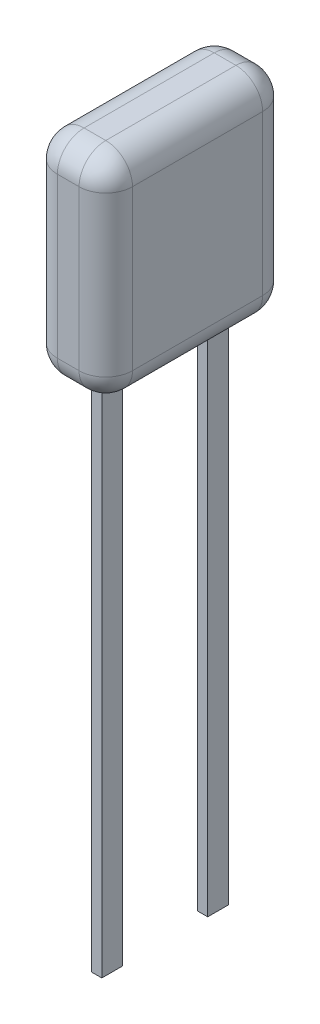
ISO-10303-21;
HEADER;
FILE_DESCRIPTION(('STEP AP214'),'2;1');
FILE_NAME('part.step','',(''),(''),'','','');
FILE_SCHEMA(('AUTOMOTIVE_DESIGN { 1 0 10303 214 1 1 1 1 }'));
ENDSEC;
DATA;
#1=APPLICATION_CONTEXT('core data for automotive mechanical design processes');
#2=APPLICATION_PROTOCOL_DEFINITION('international standard','automotive_design',2000,#1);
#3=PRODUCT_CONTEXT('',#1,'mechanical');
#4=PRODUCT('Part','Part','',(#3));
#5=PRODUCT_RELATED_PRODUCT_CATEGORY('part','',(#4));
#6=PRODUCT_DEFINITION_FORMATION('','',#4);
#7=PRODUCT_DEFINITION_CONTEXT('part definition',#1,'design');
#8=PRODUCT_DEFINITION('design','',#6,#7);
#9=PRODUCT_DEFINITION_SHAPE('','',#8);
#10=(LENGTH_UNIT() NAMED_UNIT(*) SI_UNIT(.MILLI.,.METRE.));
#11=(NAMED_UNIT(*) PLANE_ANGLE_UNIT() SI_UNIT($,.RADIAN.));
#12=(NAMED_UNIT(*) SI_UNIT($,.STERADIAN.) SOLID_ANGLE_UNIT());
#13=UNCERTAINTY_MEASURE_WITH_UNIT(LENGTH_MEASURE(1.E-05),#10,'distance_accuracy_value','');
#14=(GEOMETRIC_REPRESENTATION_CONTEXT(3) GLOBAL_UNCERTAINTY_ASSIGNED_CONTEXT((#13)) GLOBAL_UNIT_ASSIGNED_CONTEXT((#10,
#11,#12)) REPRESENTATION_CONTEXT('',''));
#15=CARTESIAN_POINT('',(0.,0.,0.));
#16=DIRECTION('',(0.,0.,1.));
#17=DIRECTION('',(1.,0.,0.));
#18=AXIS2_PLACEMENT_3D('',#15,#16,#17);
#19=CARTESIAN_POINT('',(0.775,-2.26338146433723,-1.019106057086));
#20=DIRECTION('',(0.,0.,1.));
#21=DIRECTION('',(1.,0.,0.));
#22=AXIS2_PLACEMENT_3D('',#19,#20,#21);
#23=PLANE('',#22);
#24=DIRECTION('',(1.,0.,0.));
#25=VECTOR('',#24,1.);
#26=CARTESIAN_POINT('',(0.775,-14.9260033618663,-1.019106057086));
#27=LINE('',#26,#25);
#28=CARTESIAN_POINT('',(0.775,-14.9260033618663,-1.019106057086));
#29=VERTEX_POINT('',#28);
#30=CARTESIAN_POINT('',(1.025,-14.9260033618663,-1.019106057086));
#31=VERTEX_POINT('',#30);
#32=EDGE_CURVE('E50',#29,#31,#27,.T.);
#33=ORIENTED_EDGE('',*,*,#32,.T.);
#34=DIRECTION('',(0.,-1.,0.));
#35=VECTOR('',#34,1.);
#36=CARTESIAN_POINT('',(1.025,-2.26338146433723,-1.019106057086));
#37=LINE('',#36,#35);
#38=CARTESIAN_POINT('',(1.025,-2.26338146433723,-1.019106057086));
#39=VERTEX_POINT('',#38);
#40=EDGE_CURVE('E105',#39,#31,#37,.T.);
#41=ORIENTED_EDGE('',*,*,#40,.F.);
#42=DIRECTION('',(1.,0.,0.));
#43=VECTOR('',#42,1.);
#44=CARTESIAN_POINT('',(0.775,-2.26338146433723,-1.019106057086));
#45=LINE('',#44,#43);
#46=CARTESIAN_POINT('',(0.775,-2.26338146433723,-1.019106057086));
#47=VERTEX_POINT('',#46);
#48=EDGE_CURVE('E12',#47,#39,#45,.T.);
#49=ORIENTED_EDGE('',*,*,#48,.F.);
#50=DIRECTION('',(0.,-1.,0.));
#51=VECTOR('',#50,1.);
#52=CARTESIAN_POINT('',(0.775,-2.26338146433723,-1.019106057086));
#53=LINE('',#52,#51);
#54=EDGE_CURVE('E106',#47,#29,#53,.T.);
#55=ORIENTED_EDGE('',*,*,#54,.T.);
#56=EDGE_LOOP('',(#33,#41,#49,#55));
#57=FACE_BOUND('',#56,.T.);
#58=ADVANCED_FACE('F47',(#57),#23,.T.);
#59=CARTESIAN_POINT('',(0.775,-1.34137705703162,-0.438562536616451));
#60=DIRECTION('',(0.,-0.532827878334062,0.846223641876083));
#61=DIRECTION('',(0.,-0.846223641876083,-0.532827878334062));
#62=AXIS2_PLACEMENT_3D('',#59,#60,#61);
#63=PLANE('',#62);
#64=ORIENTED_EDGE('',*,*,#48,.T.);
#65=DIRECTION('',(0.,-0.846223641876083,-0.532827878334062));
#66=VECTOR('',#65,1.);
#67=CARTESIAN_POINT('',(1.025,-1.34137705703162,-0.438562536616451));
#68=LINE('',#67,#66);
#69=CARTESIAN_POINT('',(1.025,-1.34137705703162,-0.438562536616451));
#70=VERTEX_POINT('',#69);
#71=EDGE_CURVE('E124',#70,#39,#68,.T.);
#72=ORIENTED_EDGE('',*,*,#71,.F.);
#73=DIRECTION('',(1.,0.,0.));
#74=VECTOR('',#73,1.);
#75=CARTESIAN_POINT('',(0.775,-1.34137705703162,-0.438562536616451));
#76=LINE('',#75,#74);
#77=CARTESIAN_POINT('',(0.775,-1.34137705703162,-0.438562536616451));
#78=VERTEX_POINT('',#77);
#79=EDGE_CURVE('E55',#78,#70,#76,.T.);
#80=ORIENTED_EDGE('',*,*,#79,.F.);
#81=DIRECTION('',(0.,-0.846223641876083,-0.532827878334062));
#82=VECTOR('',#81,1.);
#83=CARTESIAN_POINT('',(0.775,-1.34137705703162,-0.438562536616451));
#84=LINE('',#83,#82);
#85=EDGE_CURVE('E111',#78,#47,#84,.T.);
#86=ORIENTED_EDGE('',*,*,#85,.T.);
#87=EDGE_LOOP('',(#64,#72,#80,#86));
#88=FACE_BOUND('',#87,.T.);
#89=ADVANCED_FACE('F182',(#88),#63,.T.);
#90=CARTESIAN_POINT('',(0.775,-1.34137705703162,1.56));
#91=DIRECTION('',(0.,-1.,0.));
#92=DIRECTION('',(0.,0.,-1.));
#93=AXIS2_PLACEMENT_3D('',#90,#91,#92);
#94=PLANE('',#93);
#95=ORIENTED_EDGE('',*,*,#79,.T.);
#96=DIRECTION('',(0.,0.,-1.));
#97=VECTOR('',#96,1.);
#98=CARTESIAN_POINT('',(1.025,-1.34137705703162,1.56));
#99=LINE('',#98,#97);
#100=CARTESIAN_POINT('',(1.025,-1.34137705703162,1.56));
#101=VERTEX_POINT('',#100);
#102=EDGE_CURVE('E137',#101,#70,#99,.T.);
#103=ORIENTED_EDGE('',*,*,#102,.F.);
#104=DIRECTION('',(1.,0.,0.));
#105=VECTOR('',#104,1.);
#106=CARTESIAN_POINT('',(0.775,-1.34137705703162,1.56));
#107=LINE('',#106,#105);
#108=CARTESIAN_POINT('',(0.775,-1.34137705703162,1.56));
#109=VERTEX_POINT('',#108);
#110=EDGE_CURVE('E158',#109,#101,#107,.T.);
#111=ORIENTED_EDGE('',*,*,#110,.F.);
#112=DIRECTION('',(0.,0.,-1.));
#113=VECTOR('',#112,1.);
#114=CARTESIAN_POINT('',(0.775,-1.34137705703162,1.56));
#115=LINE('',#114,#113);
#116=EDGE_CURVE('E154',#109,#78,#115,.T.);
#117=ORIENTED_EDGE('',*,*,#116,.T.);
#118=EDGE_LOOP('',(#95,#103,#111,#117));
#119=FACE_BOUND('',#118,.T.);
#120=ADVANCED_FACE('F180',(#119),#94,.T.);
#121=CARTESIAN_POINT('',(0.775,1.91,1.56));
#122=DIRECTION('',(0.,0.,1.));
#123=DIRECTION('',(1.,0.,0.));
#124=AXIS2_PLACEMENT_3D('',#121,#122,#123);
#125=PLANE('',#124);
#126=ORIENTED_EDGE('',*,*,#110,.T.);
#127=DIRECTION('',(0.,-1.,0.));
#128=VECTOR('',#127,1.);
#129=CARTESIAN_POINT('',(1.025,1.91,1.56));
#130=LINE('',#129,#128);
#131=CARTESIAN_POINT('',(1.025,1.91,1.56));
#132=VERTEX_POINT('',#131);
#133=EDGE_CURVE('E134',#132,#101,#130,.T.);
#134=ORIENTED_EDGE('',*,*,#133,.F.);
#135=DIRECTION('',(1.,0.,0.));
#136=VECTOR('',#135,1.);
#137=CARTESIAN_POINT('',(0.775,1.91,1.56));
#138=LINE('',#137,#136);
#139=CARTESIAN_POINT('',(0.775,1.91,1.56));
#140=VERTEX_POINT('',#139);
#141=EDGE_CURVE('E160',#140,#132,#138,.T.);
#142=ORIENTED_EDGE('',*,*,#141,.F.);
#143=DIRECTION('',(0.,-1.,0.));
#144=VECTOR('',#143,1.);
#145=CARTESIAN_POINT('',(0.775,1.91,1.56));
#146=LINE('',#145,#144);
#147=EDGE_CURVE('E151',#140,#109,#146,.T.);
#148=ORIENTED_EDGE('',*,*,#147,.T.);
#149=EDGE_LOOP('',(#126,#134,#142,#148));
#150=FACE_BOUND('',#149,.T.);
#151=ADVANCED_FACE('F174',(#150),#125,.T.);
#152=CARTESIAN_POINT('',(0.775,1.91,-1.51990183240408));
#153=DIRECTION('',(0.,1.,0.));
#154=DIRECTION('',(0.,0.,1.));
#155=AXIS2_PLACEMENT_3D('',#152,#153,#154);
#156=PLANE('',#155);
#157=ORIENTED_EDGE('',*,*,#141,.T.);
#158=DIRECTION('',(0.,0.,1.));
#159=VECTOR('',#158,1.);
#160=CARTESIAN_POINT('',(1.025,1.91,-1.51990183240408));
#161=LINE('',#160,#159);
#162=CARTESIAN_POINT('',(1.025,1.91,-1.51990183240408));
#163=VERTEX_POINT('',#162);
#164=EDGE_CURVE('E131',#163,#132,#161,.T.);
#165=ORIENTED_EDGE('',*,*,#164,.F.);
#166=DIRECTION('',(1.,0.,0.));
#167=VECTOR('',#166,1.);
#168=CARTESIAN_POINT('',(0.775,1.91,-1.51990183240408));
#169=LINE('',#168,#167);
#170=CARTESIAN_POINT('',(0.775,1.91,-1.51990183240408));
#171=VERTEX_POINT('',#170);
#172=EDGE_CURVE('E162',#171,#163,#169,.T.);
#173=ORIENTED_EDGE('',*,*,#172,.F.);
#174=DIRECTION('',(0.,0.,1.));
#175=VECTOR('',#174,1.);
#176=CARTESIAN_POINT('',(0.775,1.91,-1.51990183240408));
#177=LINE('',#176,#175);
#178=EDGE_CURVE('E148',#171,#140,#177,.T.);
#179=ORIENTED_EDGE('',*,*,#178,.T.);
#180=EDGE_LOOP('',(#157,#165,#173,#179));
#181=FACE_BOUND('',#180,.T.);
#182=ADVANCED_FACE('F171',(#181),#156,.T.);
#183=CARTESIAN_POINT('',(0.775,-1.5015751773672,-1.51990183240408));
#184=DIRECTION('',(0.,0.,-1.));
#185=DIRECTION('',(-1.,0.,0.));
#186=AXIS2_PLACEMENT_3D('',#183,#184,#185);
#187=PLANE('',#186);
#188=ORIENTED_EDGE('',*,*,#172,.T.);
#189=DIRECTION('',(0.,1.,0.));
#190=VECTOR('',#189,1.);
#191=CARTESIAN_POINT('',(1.025,-14.9260033618663,-1.51990183240408));
#192=LINE('',#191,#190);
#193=CARTESIAN_POINT('',(1.025,-14.9260033618663,-1.51990183240408));
#194=VERTEX_POINT('',#193);
#195=EDGE_CURVE('E118',#194,#163,#192,.T.);
#196=ORIENTED_EDGE('',*,*,#195,.F.);
#197=DIRECTION('',(1.,0.,0.));
#198=VECTOR('',#197,1.);
#199=CARTESIAN_POINT('',(0.775,-14.9260033618663,-1.51990183240408));
#200=LINE('',#199,#198);
#201=CARTESIAN_POINT('',(0.775,-14.9260033618663,-1.51990183240408));
#202=VERTEX_POINT('',#201);
#203=EDGE_CURVE('E110',#202,#194,#200,.T.);
#204=ORIENTED_EDGE('',*,*,#203,.F.);
#205=DIRECTION('',(0.,1.,0.));
#206=VECTOR('',#205,1.);
#207=CARTESIAN_POINT('',(0.775,-14.9260033618663,-1.51990183240408));
#208=LINE('',#207,#206);
#209=EDGE_CURVE('E146',#202,#171,#208,.T.);
#210=ORIENTED_EDGE('',*,*,#209,.T.);
#211=EDGE_LOOP('',(#188,#196,#204,#210));
#212=FACE_BOUND('',#211,.T.);
#213=ADVANCED_FACE('F165',(#212),#187,.T.);
#214=CARTESIAN_POINT('',(0.775,-14.9260033618663,-1.019106057086));
#215=DIRECTION('',(0.,-1.,0.));
#216=DIRECTION('',(0.,0.,-1.));
#217=AXIS2_PLACEMENT_3D('',#214,#215,#216);
#218=PLANE('',#217);
#219=ORIENTED_EDGE('',*,*,#203,.T.);
#220=DIRECTION('',(0.,0.,-1.));
#221=VECTOR('',#220,1.);
#222=CARTESIAN_POINT('',(1.025,-14.9260033618663,-1.019106057086));
#223=LINE('',#222,#221);
#224=EDGE_CURVE('E113',#31,#194,#223,.T.);
#225=ORIENTED_EDGE('',*,*,#224,.F.);
#226=ORIENTED_EDGE('',*,*,#32,.F.);
#227=DIRECTION('',(0.,0.,-1.));
#228=VECTOR('',#227,1.);
#229=CARTESIAN_POINT('',(0.775,-14.9260033618663,-1.019106057086));
#230=LINE('',#229,#228);
#231=EDGE_CURVE('E144',#29,#202,#230,.T.);
#232=ORIENTED_EDGE('',*,*,#231,.T.);
#233=EDGE_LOOP('',(#219,#225,#226,#232));
#234=FACE_BOUND('',#233,.T.);
#235=ADVANCED_FACE('F114',(#234),#218,.T.);
#236=CARTESIAN_POINT('',(0.775,0.,0.));
#237=DIRECTION('',(1.,0.,0.));
#238=DIRECTION('',(0.,0.,-1.));
#239=AXIS2_PLACEMENT_3D('',#236,#237,#238);
#240=PLANE('',#239);
#241=CARTESIAN_POINT('',(0.775,-1.58167423753494,-1.07935501795864));
#242=DIRECTION('',(1.,0.,0.));
#243=DIRECTION('',(0.,0.,-1.));
#244=AXIS2_PLACEMENT_3D('',#241,#242,#243);
#245=CIRCLE('',#244,0.22169495175627);
#246=CARTESIAN_POINT('',(0.775,-1.58167423753494,-1.30104996971491));
#247=VERTEX_POINT('',#246);
#248=EDGE_CURVE('E140',#247,#247,#245,.T.);
#249=ORIENTED_EDGE('',*,*,#248,.T.);
#250=EDGE_LOOP('',(#249));
#251=FACE_BOUND('',#250,.T.);
#252=ORIENTED_EDGE('',*,*,#54,.F.);
#253=ORIENTED_EDGE('',*,*,#85,.F.);
#254=ORIENTED_EDGE('',*,*,#116,.F.);
#255=ORIENTED_EDGE('',*,*,#147,.F.);
#256=ORIENTED_EDGE('',*,*,#178,.F.);
#257=ORIENTED_EDGE('',*,*,#209,.F.);
#258=ORIENTED_EDGE('',*,*,#231,.F.);
#259=EDGE_LOOP('',(#252,#253,#254,#255,#256,#257,#258));
#260=FACE_BOUND('',#259,.T.);
#261=ADVANCED_FACE('F177',(#251,#260),#240,.F.);
#262=CARTESIAN_POINT('',(0.775,-1.58167423753494,-1.07935501795864));
#263=DIRECTION('',(1.,0.,0.));
#264=DIRECTION('',(0.,0.,-1.));
#265=AXIS2_PLACEMENT_3D('',#262,#263,#264);
#266=CYLINDRICAL_SURFACE('',#265,0.22169495175627);
#267=ORIENTED_EDGE('',*,*,#248,.F.);
#268=EDGE_LOOP('',(#267));
#269=FACE_BOUND('',#268,.T.);
#270=CARTESIAN_POINT('',(1.025,-1.58167423753494,-1.07935501795864));
#271=DIRECTION('',(1.,0.,0.));
#272=DIRECTION('',(0.,0.,-1.));
#273=AXIS2_PLACEMENT_3D('',#270,#271,#272);
#274=CIRCLE('',#273,0.22169495175627);
#275=CARTESIAN_POINT('',(1.025,-1.58167423753494,-1.30104996971491));
#276=VERTEX_POINT('',#275);
#277=EDGE_CURVE('E125',#276,#276,#274,.T.);
#278=ORIENTED_EDGE('',*,*,#277,.T.);
#279=EDGE_LOOP('',(#278));
#280=FACE_BOUND('',#279,.T.);
#281=ADVANCED_FACE('F202',(#269,#280),#266,.F.);
#282=CARTESIAN_POINT('',(1.025,0.,0.));
#283=DIRECTION('',(1.,0.,0.));
#284=DIRECTION('',(0.,0.,-1.));
#285=AXIS2_PLACEMENT_3D('',#282,#283,#284);
#286=PLANE('',#285);
#287=ORIENTED_EDGE('',*,*,#40,.T.);
#288=ORIENTED_EDGE('',*,*,#224,.T.);
#289=ORIENTED_EDGE('',*,*,#195,.T.);
#290=ORIENTED_EDGE('',*,*,#164,.T.);
#291=ORIENTED_EDGE('',*,*,#133,.T.);
#292=ORIENTED_EDGE('',*,*,#102,.T.);
#293=ORIENTED_EDGE('',*,*,#71,.T.);
#294=EDGE_LOOP('',(#287,#288,#289,#290,#291,#292,#293));
#295=FACE_BOUND('',#294,.T.);
#296=ORIENTED_EDGE('',*,*,#277,.F.);
#297=EDGE_LOOP('',(#296));
#298=FACE_BOUND('',#297,.T.);
#299=ADVANCED_FACE('F121',(#295,#298),#286,.T.);
#300=CLOSED_SHELL('',(#58,#89,#120,#151,#182,#213,#235,#261,#281,#299));
#301=MANIFOLD_SOLID_BREP('B2',#300);
#302=CARTESIAN_POINT('',(0.775,-1.5015751773672,1.51990183240408));
#303=DIRECTION('',(0.,0.,1.));
#304=DIRECTION('',(0.,-1.,0.));
#305=AXIS2_PLACEMENT_3D('',#302,#303,#304);
#306=PLANE('',#305);
#307=DIRECTION('',(1.,0.,0.));
#308=VECTOR('',#307,1.);
#309=CARTESIAN_POINT('',(0.775,-14.9260033618663,1.51990183240408));
#310=LINE('',#309,#308);
#311=CARTESIAN_POINT('',(0.775,-14.9260033618663,1.51990183240408));
#312=VERTEX_POINT('',#311);
#313=CARTESIAN_POINT('',(1.025,-14.9260033618663,1.51990183240408));
#314=VERTEX_POINT('',#313);
#315=EDGE_CURVE('E288',#312,#314,#310,.T.);
#316=ORIENTED_EDGE('',*,*,#315,.T.);
#317=DIRECTION('',(0.,-1.,0.));
#318=VECTOR('',#317,1.);
#319=CARTESIAN_POINT('',(1.025,-14.9260033618663,1.51990183240408));
#320=LINE('',#319,#318);
#321=CARTESIAN_POINT('',(1.025,-1.5015751773672,1.51990183240408));
#322=VERTEX_POINT('',#321);
#323=EDGE_CURVE('E340',#322,#314,#320,.T.);
#324=ORIENTED_EDGE('',*,*,#323,.F.);
#325=DIRECTION('',(1.,0.,0.));
#326=VECTOR('',#325,1.);
#327=CARTESIAN_POINT('',(0.775,-1.5015751773672,1.51990183240408));
#328=LINE('',#327,#326);
#329=CARTESIAN_POINT('',(0.775,-1.5015751773672,1.51990183240408));
#330=VERTEX_POINT('',#329);
#331=EDGE_CURVE('E45',#330,#322,#328,.T.);
#332=ORIENTED_EDGE('',*,*,#331,.F.);
#333=DIRECTION('',(0.,-1.,0.));
#334=VECTOR('',#333,1.);
#335=CARTESIAN_POINT('',(0.775,-14.9260033618663,1.51990183240408));
#336=LINE('',#335,#334);
#337=EDGE_CURVE('E301',#330,#312,#336,.T.);
#338=ORIENTED_EDGE('',*,*,#337,.T.);
#339=EDGE_LOOP('',(#316,#324,#332,#338));
#340=FACE_BOUND('',#339,.T.);
#341=ADVANCED_FACE('F284',(#340),#306,.T.);
#342=CARTESIAN_POINT('',(0.775,-1.5015751773672,0.353528169487082));
#343=DIRECTION('',(0.,1.,0.));
#344=DIRECTION('',(0.,0.,1.));
#345=AXIS2_PLACEMENT_3D('',#342,#343,#344);
#346=PLANE('',#345);
#347=ORIENTED_EDGE('',*,*,#331,.T.);
#348=DIRECTION('',(0.,0.,1.));
#349=VECTOR('',#348,1.);
#350=CARTESIAN_POINT('',(1.025,-1.5015751773672,0.353528169487082));
#351=LINE('',#350,#349);
#352=CARTESIAN_POINT('',(1.025,-1.5015751773672,0.353528169487082));
#353=VERTEX_POINT('',#352);
#354=EDGE_CURVE('E356',#353,#322,#351,.T.);
#355=ORIENTED_EDGE('',*,*,#354,.F.);
#356=DIRECTION('',(1.,0.,0.));
#357=VECTOR('',#356,1.);
#358=CARTESIAN_POINT('',(0.775,-1.5015751773672,0.353528169487082));
#359=LINE('',#358,#357);
#360=CARTESIAN_POINT('',(0.775,-1.5015751773672,0.353528169487082));
#361=VERTEX_POINT('',#360);
#362=EDGE_CURVE('E293',#361,#353,#359,.T.);
#363=ORIENTED_EDGE('',*,*,#362,.F.);
#364=DIRECTION('',(0.,0.,1.));
#365=VECTOR('',#364,1.);
#366=CARTESIAN_POINT('',(0.775,-1.5015751773672,0.353528169487082));
#367=LINE('',#366,#365);
#368=EDGE_CURVE('E345',#361,#330,#367,.T.);
#369=ORIENTED_EDGE('',*,*,#368,.T.);
#370=EDGE_LOOP('',(#347,#355,#363,#369));
#371=FACE_BOUND('',#370,.T.);
#372=ADVANCED_FACE('F401',(#371),#346,.T.);
#373=CARTESIAN_POINT('',(0.775,-1.99840935713358,0.353528169487082));
#374=DIRECTION('',(0.,0.,-1.));
#375=DIRECTION('',(-1.,0.,0.));
#376=AXIS2_PLACEMENT_3D('',#373,#374,#375);
#377=PLANE('',#376);
#378=ORIENTED_EDGE('',*,*,#362,.T.);
#379=DIRECTION('',(0.,1.,0.));
#380=VECTOR('',#379,1.);
#381=CARTESIAN_POINT('',(1.025,-1.99840935713358,0.353528169487082));
#382=LINE('',#381,#380);
#383=CARTESIAN_POINT('',(1.025,-1.99840935713358,0.353528169487082));
#384=VERTEX_POINT('',#383);
#385=EDGE_CURVE('E366',#384,#353,#382,.T.);
#386=ORIENTED_EDGE('',*,*,#385,.F.);
#387=DIRECTION('',(1.,0.,0.));
#388=VECTOR('',#387,1.);
#389=CARTESIAN_POINT('',(0.775,-1.99840935713358,0.353528169487082));
#390=LINE('',#389,#388);
#391=CARTESIAN_POINT('',(0.775,-1.99840935713358,0.353528169487082));
#392=VERTEX_POINT('',#391);
#393=EDGE_CURVE('E386',#392,#384,#390,.T.);
#394=ORIENTED_EDGE('',*,*,#393,.F.);
#395=DIRECTION('',(0.,1.,0.));
#396=VECTOR('',#395,1.);
#397=CARTESIAN_POINT('',(0.775,-1.99840935713358,0.353528169487082));
#398=LINE('',#397,#396);
#399=EDGE_CURVE('E381',#392,#361,#398,.T.);
#400=ORIENTED_EDGE('',*,*,#399,.T.);
#401=EDGE_LOOP('',(#378,#386,#394,#400));
#402=FACE_BOUND('',#401,.T.);
#403=ADVANCED_FACE('F399',(#402),#377,.T.);
#404=CARTESIAN_POINT('',(0.775,-2.26338146433723,1.019106057086));
#405=DIRECTION('',(0.,-0.929081491740432,-0.369875089327971));
#406=DIRECTION('',(0.,0.369875089327971,-0.929081491740432));
#407=AXIS2_PLACEMENT_3D('',#404,#405,#406);
#408=PLANE('',#407);
#409=ORIENTED_EDGE('',*,*,#393,.T.);
#410=DIRECTION('',(0.,0.369875089327971,-0.929081491740432));
#411=VECTOR('',#410,1.);
#412=CARTESIAN_POINT('',(1.025,-2.26338146433723,1.019106057086));
#413=LINE('',#412,#411);
#414=CARTESIAN_POINT('',(1.025,-2.26338146433723,1.019106057086));
#415=VERTEX_POINT('',#414);
#416=EDGE_CURVE('E363',#415,#384,#413,.T.);
#417=ORIENTED_EDGE('',*,*,#416,.F.);
#418=DIRECTION('',(1.,0.,0.));
#419=VECTOR('',#418,1.);
#420=CARTESIAN_POINT('',(0.775,-2.26338146433723,1.019106057086));
#421=LINE('',#420,#419);
#422=CARTESIAN_POINT('',(0.775,-2.26338146433723,1.019106057086));
#423=VERTEX_POINT('',#422);
#424=EDGE_CURVE('E388',#423,#415,#421,.T.);
#425=ORIENTED_EDGE('',*,*,#424,.F.);
#426=DIRECTION('',(0.,0.369875089327971,-0.929081491740432));
#427=VECTOR('',#426,1.);
#428=CARTESIAN_POINT('',(0.775,-2.26338146433723,1.019106057086));
#429=LINE('',#428,#427);
#430=EDGE_CURVE('E378',#423,#392,#429,.T.);
#431=ORIENTED_EDGE('',*,*,#430,.T.);
#432=EDGE_LOOP('',(#409,#417,#425,#431));
#433=FACE_BOUND('',#432,.T.);
#434=ADVANCED_FACE('F396',(#433),#408,.T.);
#435=CARTESIAN_POINT('',(0.775,-2.26338146433723,1.019106057086));
#436=DIRECTION('',(0.,0.,-1.));
#437=DIRECTION('',(-1.,0.,0.));
#438=AXIS2_PLACEMENT_3D('',#435,#436,#437);
#439=PLANE('',#438);
#440=ORIENTED_EDGE('',*,*,#424,.T.);
#441=DIRECTION('',(0.,1.,0.));
#442=VECTOR('',#441,1.);
#443=CARTESIAN_POINT('',(1.025,-2.26338146433723,1.019106057086));
#444=LINE('',#443,#442);
#445=CARTESIAN_POINT('',(1.025,-14.9260033618663,1.019106057086));
#446=VERTEX_POINT('',#445);
#447=EDGE_CURVE('E351',#446,#415,#444,.T.);
#448=ORIENTED_EDGE('',*,*,#447,.F.);
#449=DIRECTION('',(1.,0.,0.));
#450=VECTOR('',#449,1.);
#451=CARTESIAN_POINT('',(0.775,-14.9260033618663,1.019106057086));
#452=LINE('',#451,#450);
#453=CARTESIAN_POINT('',(0.775,-14.9260033618663,1.019106057086));
#454=VERTEX_POINT('',#453);
#455=EDGE_CURVE('E344',#454,#446,#452,.T.);
#456=ORIENTED_EDGE('',*,*,#455,.F.);
#457=DIRECTION('',(0.,1.,0.));
#458=VECTOR('',#457,1.);
#459=CARTESIAN_POINT('',(0.775,-2.26338146433723,1.019106057086));
#460=LINE('',#459,#458);
#461=EDGE_CURVE('E375',#454,#423,#460,.T.);
#462=ORIENTED_EDGE('',*,*,#461,.T.);
#463=EDGE_LOOP('',(#440,#448,#456,#462));
#464=FACE_BOUND('',#463,.T.);
#465=ADVANCED_FACE('F390',(#464),#439,.T.);
#466=CARTESIAN_POINT('',(0.775,-14.9260033618663,1.019106057086));
#467=DIRECTION('',(0.,-1.,0.));
#468=DIRECTION('',(0.,0.,-1.));
#469=AXIS2_PLACEMENT_3D('',#466,#467,#468);
#470=PLANE('',#469);
#471=ORIENTED_EDGE('',*,*,#455,.T.);
#472=DIRECTION('',(0.,0.,-1.));
#473=VECTOR('',#472,1.);
#474=CARTESIAN_POINT('',(1.025,-14.9260033618663,1.019106057086));
#475=LINE('',#474,#473);
#476=EDGE_CURVE('E347',#314,#446,#475,.T.);
#477=ORIENTED_EDGE('',*,*,#476,.F.);
#478=ORIENTED_EDGE('',*,*,#315,.F.);
#479=DIRECTION('',(0.,0.,-1.));
#480=VECTOR('',#479,1.);
#481=CARTESIAN_POINT('',(0.775,-14.9260033618663,1.019106057086));
#482=LINE('',#481,#480);
#483=EDGE_CURVE('E373',#312,#454,#482,.T.);
#484=ORIENTED_EDGE('',*,*,#483,.T.);
#485=EDGE_LOOP('',(#471,#477,#478,#484));
#486=FACE_BOUND('',#485,.T.);
#487=ADVANCED_FACE('F286',(#486),#470,.T.);
#488=CARTESIAN_POINT('',(0.775,0.,0.));
#489=DIRECTION('',(1.,0.,0.));
#490=DIRECTION('',(0.,0.,-1.));
#491=AXIS2_PLACEMENT_3D('',#488,#489,#490);
#492=PLANE('',#491);
#493=CARTESIAN_POINT('',(0.775,-1.85757100033504,1.019106057086));
#494=DIRECTION('',(1.,0.,0.));
#495=DIRECTION('',(0.,0.,-1.));
#496=AXIS2_PLACEMENT_3D('',#493,#494,#495);
#497=CIRCLE('',#496,0.228124389067957);
#498=CARTESIAN_POINT('',(0.775,-1.85757100033504,0.790981668018042));
#499=VERTEX_POINT('',#498);
#500=EDGE_CURVE('E369',#499,#499,#497,.T.);
#501=ORIENTED_EDGE('',*,*,#500,.T.);
#502=EDGE_LOOP('',(#501));
#503=FACE_BOUND('',#502,.T.);
#504=ORIENTED_EDGE('',*,*,#337,.F.);
#505=ORIENTED_EDGE('',*,*,#368,.F.);
#506=ORIENTED_EDGE('',*,*,#399,.F.);
#507=ORIENTED_EDGE('',*,*,#430,.F.);
#508=ORIENTED_EDGE('',*,*,#461,.F.);
#509=ORIENTED_EDGE('',*,*,#483,.F.);
#510=EDGE_LOOP('',(#504,#505,#506,#507,#508,#509));
#511=FACE_BOUND('',#510,.T.);
#512=ADVANCED_FACE('F400',(#503,#511),#492,.F.);
#513=CARTESIAN_POINT('',(0.775,-1.85757100033504,1.019106057086));
#514=DIRECTION('',(1.,0.,0.));
#515=DIRECTION('',(0.,0.,-1.));
#516=AXIS2_PLACEMENT_3D('',#513,#514,#515);
#517=CYLINDRICAL_SURFACE('',#516,0.228124389067957);
#518=ORIENTED_EDGE('',*,*,#500,.F.);
#519=EDGE_LOOP('',(#518));
#520=FACE_BOUND('',#519,.T.);
#521=CARTESIAN_POINT('',(1.025,-1.85757100033504,1.019106057086));
#522=DIRECTION('',(1.,0.,0.));
#523=DIRECTION('',(0.,0.,-1.));
#524=AXIS2_PLACEMENT_3D('',#521,#522,#523);
#525=CIRCLE('',#524,0.228124389067957);
#526=CARTESIAN_POINT('',(1.025,-1.85757100033504,0.790981668018042));
#527=VERTEX_POINT('',#526);
#528=EDGE_CURVE('E357',#527,#527,#525,.T.);
#529=ORIENTED_EDGE('',*,*,#528,.T.);
#530=EDGE_LOOP('',(#529));
#531=FACE_BOUND('',#530,.T.);
#532=ADVANCED_FACE('F420',(#520,#531),#517,.F.);
#533=CARTESIAN_POINT('',(1.025,0.,0.));
#534=DIRECTION('',(1.,0.,0.));
#535=DIRECTION('',(0.,0.,-1.));
#536=AXIS2_PLACEMENT_3D('',#533,#534,#535);
#537=PLANE('',#536);
#538=ORIENTED_EDGE('',*,*,#323,.T.);
#539=ORIENTED_EDGE('',*,*,#476,.T.);
#540=ORIENTED_EDGE('',*,*,#447,.T.);
#541=ORIENTED_EDGE('',*,*,#416,.T.);
#542=ORIENTED_EDGE('',*,*,#385,.T.);
#543=ORIENTED_EDGE('',*,*,#354,.T.);
#544=EDGE_LOOP('',(#538,#539,#540,#541,#542,#543));
#545=FACE_BOUND('',#544,.T.);
#546=ORIENTED_EDGE('',*,*,#528,.F.);
#547=EDGE_LOOP('',(#546));
#548=FACE_BOUND('',#547,.T.);
#549=ADVANCED_FACE('F353',(#545,#548),#537,.T.);
#550=CLOSED_SHELL('',(#341,#372,#403,#434,#465,#487,#512,#532,#549));
#551=MANIFOLD_SOLID_BREP('B6',#550);
#552=CARTESIAN_POINT('',(1.8,-1.91,1.56));
#553=DIRECTION('',(-1.,0.,0.));
#554=DIRECTION('',(0.,0.,1.));
#555=AXIS2_PLACEMENT_3D('',#552,#553,#554);
#556=CYLINDRICAL_SURFACE('',#555,0.64);
#557=DIRECTION('',(-1.,0.,0.));
#558=VECTOR('',#557,1.);
#559=CARTESIAN_POINT('',(1.8,-2.55,1.55999999999999));
#560=LINE('',#559,#558);
#561=CARTESIAN_POINT('',(1.16,-2.55,1.55999999999999));
#562=VERTEX_POINT('',#561);
#563=CARTESIAN_POINT('',(0.64,-2.55,1.55999999999999));
#564=VERTEX_POINT('',#563);
#565=EDGE_CURVE('E704',#562,#564,#560,.T.);
#566=ORIENTED_EDGE('',*,*,#565,.F.);
#567=CARTESIAN_POINT('',(1.16,-1.91,1.56));
#568=DIRECTION('',(-1.,0.,0.));
#569=DIRECTION('',(0.,0.,1.));
#570=AXIS2_PLACEMENT_3D('',#567,#568,#569);
#571=CIRCLE('',#570,0.64);
#572=CARTESIAN_POINT('',(1.16,-1.90999999999999,2.2));
#573=VERTEX_POINT('',#572);
#574=EDGE_CURVE('E663',#562,#573,#571,.T.);
#575=ORIENTED_EDGE('',*,*,#574,.T.);
#576=DIRECTION('',(-1.,0.,0.));
#577=VECTOR('',#576,1.);
#578=CARTESIAN_POINT('',(1.8,-1.90999999999999,2.2));
#579=LINE('',#578,#577);
#580=CARTESIAN_POINT('',(0.64,-1.90999999999999,2.2));
#581=VERTEX_POINT('',#580);
#582=EDGE_CURVE('E631',#573,#581,#579,.T.);
#583=ORIENTED_EDGE('',*,*,#582,.T.);
#584=CARTESIAN_POINT('',(0.64,-1.91,1.56));
#585=DIRECTION('',(-1.,0.,0.));
#586=DIRECTION('',(0.,0.,1.));
#587=AXIS2_PLACEMENT_3D('',#584,#585,#586);
#588=CIRCLE('',#587,0.64);
#589=EDGE_CURVE('E658',#581,#564,#588,.F.);
#590=ORIENTED_EDGE('',*,*,#589,.T.);
#591=EDGE_LOOP('',(#566,#575,#583,#590));
#592=FACE_BOUND('',#591,.T.);
#593=ADVANCED_FACE('F483',(#592),#556,.T.);
#594=CARTESIAN_POINT('',(1.8,-2.55,1.55999999999999));
#595=DIRECTION('',(0.,1.,0.));
#596=DIRECTION('',(0.,0.,1.));
#597=AXIS2_PLACEMENT_3D('',#594,#595,#596);
#598=PLANE('',#597);
#599=DIRECTION('',(-1.,0.,0.));
#600=VECTOR('',#599,1.);
#601=CARTESIAN_POINT('',(1.8,-2.55,-1.56));
#602=LINE('',#601,#600);
#603=CARTESIAN_POINT('',(1.16,-2.55,-1.56));
#604=VERTEX_POINT('',#603);
#605=CARTESIAN_POINT('',(0.64,-2.55,-1.56));
#606=VERTEX_POINT('',#605);
#607=EDGE_CURVE('E706',#604,#606,#602,.T.);
#608=ORIENTED_EDGE('',*,*,#607,.F.);
#609=DIRECTION('',(0.,0.,-1.));
#610=VECTOR('',#609,1.);
#611=CARTESIAN_POINT('',(1.16,-2.55,1.55999999999999));
#612=LINE('',#611,#610);
#613=EDGE_CURVE('E664',#604,#562,#612,.F.);
#614=ORIENTED_EDGE('',*,*,#613,.T.);
#615=ORIENTED_EDGE('',*,*,#565,.T.);
#616=DIRECTION('',(0.,0.,-1.));
#617=VECTOR('',#616,1.);
#618=CARTESIAN_POINT('',(0.64,-2.55,1.55999999999999));
#619=LINE('',#618,#617);
#620=EDGE_CURVE('E667',#564,#606,#619,.T.);
#621=ORIENTED_EDGE('',*,*,#620,.T.);
#622=EDGE_LOOP('',(#608,#614,#615,#621));
#623=FACE_BOUND('',#622,.T.);
#624=ADVANCED_FACE('F727',(#623),#598,.F.);
#625=CARTESIAN_POINT('',(1.8,-1.91,-1.56));
#626=DIRECTION('',(-1.,0.,0.));
#627=DIRECTION('',(0.,0.,1.));
#628=AXIS2_PLACEMENT_3D('',#625,#626,#627);
#629=CYLINDRICAL_SURFACE('',#628,0.64);
#630=DIRECTION('',(-1.,0.,0.));
#631=VECTOR('',#630,1.);
#632=CARTESIAN_POINT('',(1.8,-1.90999999999999,-2.2));
#633=LINE('',#632,#631);
#634=CARTESIAN_POINT('',(1.16,-1.90999999999999,-2.2));
#635=VERTEX_POINT('',#634);
#636=CARTESIAN_POINT('',(0.64,-1.90999999999999,-2.2));
#637=VERTEX_POINT('',#636);
#638=EDGE_CURVE('E737',#635,#637,#633,.T.);
#639=ORIENTED_EDGE('',*,*,#638,.F.);
#640=CARTESIAN_POINT('',(1.16,-1.91,-1.56));
#641=DIRECTION('',(-1.,0.,0.));
#642=DIRECTION('',(0.,0.,1.));
#643=AXIS2_PLACEMENT_3D('',#640,#641,#642);
#644=CIRCLE('',#643,0.64);
#645=EDGE_CURVE('E723',#635,#604,#644,.T.);
#646=ORIENTED_EDGE('',*,*,#645,.T.);
#647=ORIENTED_EDGE('',*,*,#607,.T.);
#648=CARTESIAN_POINT('',(0.64,-1.91,-1.56));
#649=DIRECTION('',(-1.,0.,0.));
#650=DIRECTION('',(0.,0.,1.));
#651=AXIS2_PLACEMENT_3D('',#648,#649,#650);
#652=CIRCLE('',#651,0.64);
#653=EDGE_CURVE('E721',#606,#637,#652,.F.);
#654=ORIENTED_EDGE('',*,*,#653,.T.);
#655=EDGE_LOOP('',(#639,#646,#647,#654));
#656=FACE_BOUND('',#655,.T.);
#657=ADVANCED_FACE('F733',(#656),#629,.T.);
#658=CARTESIAN_POINT('',(1.8,1.91,-2.2));
#659=DIRECTION('',(0.,0.,1.));
#660=DIRECTION('',(0.,-1.,0.));
#661=AXIS2_PLACEMENT_3D('',#658,#659,#660);
#662=PLANE('',#661);
#663=DIRECTION('',(-1.,0.,0.));
#664=VECTOR('',#663,1.);
#665=CARTESIAN_POINT('',(1.8,1.91,-2.2));
#666=LINE('',#665,#664);
#667=CARTESIAN_POINT('',(1.16,1.91,-2.2));
#668=VERTEX_POINT('',#667);
#669=CARTESIAN_POINT('',(0.64,1.91,-2.2));
#670=VERTEX_POINT('',#669);
#671=EDGE_CURVE('E596',#668,#670,#666,.T.);
#672=ORIENTED_EDGE('',*,*,#671,.F.);
#673=DIRECTION('',(0.,1.,0.));
#674=VECTOR('',#673,1.);
#675=CARTESIAN_POINT('',(1.16,-1.90999999999999,-2.2));
#676=LINE('',#675,#674);
#677=EDGE_CURVE('E719',#668,#635,#676,.F.);
#678=ORIENTED_EDGE('',*,*,#677,.T.);
#679=ORIENTED_EDGE('',*,*,#638,.T.);
#680=DIRECTION('',(0.,1.,0.));
#681=VECTOR('',#680,1.);
#682=CARTESIAN_POINT('',(0.64,1.91,-2.2));
#683=LINE('',#682,#681);
#684=EDGE_CURVE('E717',#637,#670,#683,.T.);
#685=ORIENTED_EDGE('',*,*,#684,.T.);
#686=EDGE_LOOP('',(#672,#678,#679,#685));
#687=FACE_BOUND('',#686,.T.);
#688=ADVANCED_FACE('F742',(#687),#662,.F.);
#689=CARTESIAN_POINT('',(1.8,1.91,-1.56));
#690=DIRECTION('',(-1.,0.,0.));
#691=DIRECTION('',(0.,0.,1.));
#692=AXIS2_PLACEMENT_3D('',#689,#690,#691);
#693=CYLINDRICAL_SURFACE('',#692,0.64);
#694=DIRECTION('',(-1.,0.,0.));
#695=VECTOR('',#694,1.);
#696=CARTESIAN_POINT('',(1.8,2.55,-1.56));
#697=LINE('',#696,#695);
#698=CARTESIAN_POINT('',(1.16,2.55,-1.56));
#699=VERTEX_POINT('',#698);
#700=CARTESIAN_POINT('',(0.64,2.55,-1.56));
#701=VERTEX_POINT('',#700);
#702=EDGE_CURVE('E579',#699,#701,#697,.T.);
#703=ORIENTED_EDGE('',*,*,#702,.F.);
#704=CARTESIAN_POINT('',(1.16,1.91,-1.56));
#705=DIRECTION('',(-1.,0.,0.));
#706=DIRECTION('',(0.,0.,1.));
#707=AXIS2_PLACEMENT_3D('',#704,#705,#706);
#708=CIRCLE('',#707,0.64);
#709=EDGE_CURVE('E592',#699,#668,#708,.T.);
#710=ORIENTED_EDGE('',*,*,#709,.T.);
#711=ORIENTED_EDGE('',*,*,#671,.T.);
#712=CARTESIAN_POINT('',(0.64,1.91,-1.56));
#713=DIRECTION('',(-1.,0.,0.));
#714=DIRECTION('',(0.,0.,1.));
#715=AXIS2_PLACEMENT_3D('',#712,#713,#714);
#716=CIRCLE('',#715,0.64);
#717=EDGE_CURVE('E595',#670,#701,#716,.F.);
#718=ORIENTED_EDGE('',*,*,#717,.T.);
#719=EDGE_LOOP('',(#703,#710,#711,#718));
#720=FACE_BOUND('',#719,.T.);
#721=ADVANCED_FACE('F590',(#720),#693,.T.);
#722=CARTESIAN_POINT('',(1.8,2.55,1.56));
#723=DIRECTION('',(0.,-1.,0.));
#724=DIRECTION('',(0.,0.,-1.));
#725=AXIS2_PLACEMENT_3D('',#722,#723,#724);
#726=PLANE('',#725);
#727=DIRECTION('',(-1.,0.,0.));
#728=VECTOR('',#727,1.);
#729=CARTESIAN_POINT('',(1.8,2.55,1.56));
#730=LINE('',#729,#728);
#731=CARTESIAN_POINT('',(1.16,2.55,1.56));
#732=VERTEX_POINT('',#731);
#733=CARTESIAN_POINT('',(0.64,2.55,1.56));
#734=VERTEX_POINT('',#733);
#735=EDGE_CURVE('E581',#732,#734,#730,.T.);
#736=ORIENTED_EDGE('',*,*,#735,.F.);
#737=DIRECTION('',(0.,0.,1.));
#738=VECTOR('',#737,1.);
#739=CARTESIAN_POINT('',(1.16,2.55,-1.56));
#740=LINE('',#739,#738);
#741=EDGE_CURVE('E282',#732,#699,#740,.F.);
#742=ORIENTED_EDGE('',*,*,#741,.T.);
#743=ORIENTED_EDGE('',*,*,#702,.T.);
#744=DIRECTION('',(0.,0.,1.));
#745=VECTOR('',#744,1.);
#746=CARTESIAN_POINT('',(0.64,2.55,1.56));
#747=LINE('',#746,#745);
#748=EDGE_CURVE('E492',#701,#734,#747,.T.);
#749=ORIENTED_EDGE('',*,*,#748,.T.);
#750=EDGE_LOOP('',(#736,#742,#743,#749));
#751=FACE_BOUND('',#750,.T.);
#752=ADVANCED_FACE('F578',(#751),#726,.F.);
#753=CARTESIAN_POINT('',(1.8,1.91,1.56));
#754=DIRECTION('',(-1.,0.,0.));
#755=DIRECTION('',(0.,0.,1.));
#756=AXIS2_PLACEMENT_3D('',#753,#754,#755);
#757=CYLINDRICAL_SURFACE('',#756,0.64);
#758=DIRECTION('',(-1.,0.,0.));
#759=VECTOR('',#758,1.);
#760=CARTESIAN_POINT('',(1.8,1.91,2.2));
#761=LINE('',#760,#759);
#762=CARTESIAN_POINT('',(1.16,1.91,2.2));
#763=VERTEX_POINT('',#762);
#764=CARTESIAN_POINT('',(0.64,1.91,2.2));
#765=VERTEX_POINT('',#764);
#766=EDGE_CURVE('E692',#763,#765,#761,.T.);
#767=ORIENTED_EDGE('',*,*,#766,.F.);
#768=CARTESIAN_POINT('',(1.16,1.91,1.56));
#769=DIRECTION('',(-1.,0.,0.));
#770=DIRECTION('',(0.,0.,1.));
#771=AXIS2_PLACEMENT_3D('',#768,#769,#770);
#772=CIRCLE('',#771,0.64);
#773=EDGE_CURVE('E676',#763,#732,#772,.T.);
#774=ORIENTED_EDGE('',*,*,#773,.T.);
#775=ORIENTED_EDGE('',*,*,#735,.T.);
#776=CARTESIAN_POINT('',(0.64,1.91,1.56));
#777=DIRECTION('',(-1.,0.,0.));
#778=DIRECTION('',(0.,0.,1.));
#779=AXIS2_PLACEMENT_3D('',#776,#777,#778);
#780=CIRCLE('',#779,0.64);
#781=EDGE_CURVE('E674',#734,#765,#780,.F.);
#782=ORIENTED_EDGE('',*,*,#781,.T.);
#783=EDGE_LOOP('',(#767,#774,#775,#782));
#784=FACE_BOUND('',#783,.T.);
#785=ADVANCED_FACE('F689',(#784),#757,.T.);
#786=CARTESIAN_POINT('',(1.8,1.91,2.2));
#787=DIRECTION('',(0.,0.,-1.));
#788=DIRECTION('',(0.,1.,0.));
#789=AXIS2_PLACEMENT_3D('',#786,#787,#788);
#790=PLANE('',#789);
#791=ORIENTED_EDGE('',*,*,#582,.F.);
#792=DIRECTION('',(0.,-1.,0.));
#793=VECTOR('',#792,1.);
#794=CARTESIAN_POINT('',(1.16,1.91,2.2));
#795=LINE('',#794,#793);
#796=EDGE_CURVE('E672',#573,#763,#795,.F.);
#797=ORIENTED_EDGE('',*,*,#796,.T.);
#798=ORIENTED_EDGE('',*,*,#766,.T.);
#799=DIRECTION('',(0.,-1.,0.));
#800=VECTOR('',#799,1.);
#801=CARTESIAN_POINT('',(0.64,1.91,2.2));
#802=LINE('',#801,#800);
#803=EDGE_CURVE('E652',#765,#581,#802,.T.);
#804=ORIENTED_EDGE('',*,*,#803,.T.);
#805=EDGE_LOOP('',(#791,#797,#798,#804));
#806=FACE_BOUND('',#805,.T.);
#807=ADVANCED_FACE('F751',(#806),#790,.F.);
#808=CARTESIAN_POINT('',(1.8,-1.91,1.56));
#809=DIRECTION('',(1.,0.,0.));
#810=DIRECTION('',(0.,0.,-1.));
#811=AXIS2_PLACEMENT_3D('',#808,#809,#810);
#812=PLANE('',#811);
#813=DIRECTION('',(0.,0.,-1.));
#814=VECTOR('',#813,1.);
#815=CARTESIAN_POINT('',(1.8,-1.91,-1.56));
#816=LINE('',#815,#814);
#817=CARTESIAN_POINT('',(1.8,-1.91,1.56));
#818=VERTEX_POINT('',#817);
#819=CARTESIAN_POINT('',(1.8,-1.91,-1.56));
#820=VERTEX_POINT('',#819);
#821=EDGE_CURVE('E713',#818,#820,#816,.T.);
#822=ORIENTED_EDGE('',*,*,#821,.T.);
#823=DIRECTION('',(0.,1.,0.));
#824=VECTOR('',#823,1.);
#825=CARTESIAN_POINT('',(1.8,1.91,-1.56));
#826=LINE('',#825,#824);
#827=CARTESIAN_POINT('',(1.8,1.91,-1.56));
#828=VERTEX_POINT('',#827);
#829=EDGE_CURVE('E715',#820,#828,#826,.T.);
#830=ORIENTED_EDGE('',*,*,#829,.T.);
#831=DIRECTION('',(0.,0.,1.));
#832=VECTOR('',#831,1.);
#833=CARTESIAN_POINT('',(1.8,1.91,1.56));
#834=LINE('',#833,#832);
#835=CARTESIAN_POINT('',(1.8,1.91,1.56));
#836=VERTEX_POINT('',#835);
#837=EDGE_CURVE('E604',#828,#836,#834,.T.);
#838=ORIENTED_EDGE('',*,*,#837,.T.);
#839=DIRECTION('',(0.,-1.,0.));
#840=VECTOR('',#839,1.);
#841=CARTESIAN_POINT('',(1.8,-1.90999999999999,1.56));
#842=LINE('',#841,#840);
#843=EDGE_CURVE('E711',#836,#818,#842,.T.);
#844=ORIENTED_EDGE('',*,*,#843,.T.);
#845=EDGE_LOOP('',(#822,#830,#838,#844));
#846=FACE_BOUND('',#845,.T.);
#847=ADVANCED_FACE('F904',(#846),#812,.T.);
#848=CARTESIAN_POINT('',(0.,-1.91,1.56));
#849=DIRECTION('',(1.,0.,0.));
#850=DIRECTION('',(0.,0.,-1.));
#851=AXIS2_PLACEMENT_3D('',#848,#849,#850);
#852=PLANE('',#851);
#853=DIRECTION('',(0.,0.,1.));
#854=VECTOR('',#853,1.);
#855=CARTESIAN_POINT('',(0.,1.91,1.56));
#856=LINE('',#855,#854);
#857=CARTESIAN_POINT('',(0.,1.91,1.56));
#858=VERTEX_POINT('',#857);
#859=CARTESIAN_POINT('',(0.,1.91,-1.56));
#860=VERTEX_POINT('',#859);
#861=EDGE_CURVE('E678',#858,#860,#856,.F.);
#862=ORIENTED_EDGE('',*,*,#861,.T.);
#863=DIRECTION('',(0.,1.,0.));
#864=VECTOR('',#863,1.);
#865=CARTESIAN_POINT('',(0.,-1.91,-1.56));
#866=LINE('',#865,#864);
#867=CARTESIAN_POINT('',(0.,-1.91,-1.56));
#868=VERTEX_POINT('',#867);
#869=EDGE_CURVE('E682',#860,#868,#866,.F.);
#870=ORIENTED_EDGE('',*,*,#869,.T.);
#871=DIRECTION('',(0.,0.,-1.));
#872=VECTOR('',#871,1.);
#873=CARTESIAN_POINT('',(0.,-1.91,1.56));
#874=LINE('',#873,#872);
#875=CARTESIAN_POINT('',(0.,-1.91,1.56));
#876=VERTEX_POINT('',#875);
#877=EDGE_CURVE('E508',#868,#876,#874,.F.);
#878=ORIENTED_EDGE('',*,*,#877,.T.);
#879=DIRECTION('',(0.,-1.,0.));
#880=VECTOR('',#879,1.);
#881=CARTESIAN_POINT('',(0.,-1.91,1.56));
#882=LINE('',#881,#880);
#883=EDGE_CURVE('E653',#876,#858,#882,.F.);
#884=ORIENTED_EDGE('',*,*,#883,.T.);
#885=EDGE_LOOP('',(#862,#870,#878,#884));
#886=FACE_BOUND('',#885,.T.);
#887=ADVANCED_FACE('F699',(#886),#852,.F.);
#888=CARTESIAN_POINT('',(1.16,-1.91,1.56));
#889=DIRECTION('',(0.,0.,1.));
#890=DIRECTION('',(1.,0.,0.));
#891=AXIS2_PLACEMENT_3D('',#888,#889,#890);
#892=SPHERICAL_SURFACE('',#891,0.64);
#893=CARTESIAN_POINT('',(1.16,-1.91,1.56));
#894=DIRECTION('',(0.,1.,0.));
#895=DIRECTION('',(0.,0.,1.));
#896=AXIS2_PLACEMENT_3D('',#893,#894,#895);
#897=CIRCLE('',#896,0.64);
#898=EDGE_CURVE('E625',#573,#818,#897,.T.);
#899=ORIENTED_EDGE('',*,*,#898,.F.);
#900=ORIENTED_EDGE('',*,*,#574,.F.);
#901=CARTESIAN_POINT('',(1.16,-1.91,1.56));
#902=DIRECTION('',(0.,0.,-1.));
#903=DIRECTION('',(0.,1.,0.));
#904=AXIS2_PLACEMENT_3D('',#901,#902,#903);
#905=CIRCLE('',#904,0.64);
#906=EDGE_CURVE('E628',#818,#562,#905,.T.);
#907=ORIENTED_EDGE('',*,*,#906,.F.);
#908=EDGE_LOOP('',(#899,#900,#907));
#909=FACE_BOUND('',#908,.T.);
#910=ADVANCED_FACE('F755',(#909),#892,.T.);
#911=CARTESIAN_POINT('',(1.16,-1.91,1.56));
#912=DIRECTION('',(0.,0.,1.));
#913=DIRECTION('',(1.,0.,0.));
#914=AXIS2_PLACEMENT_3D('',#911,#912,#913);
#915=CYLINDRICAL_SURFACE('',#914,0.64);
#916=ORIENTED_EDGE('',*,*,#906,.T.);
#917=ORIENTED_EDGE('',*,*,#613,.F.);
#918=CARTESIAN_POINT('',(1.16,-1.91,-1.56));
#919=DIRECTION('',(0.,0.,-1.));
#920=DIRECTION('',(0.,1.,0.));
#921=AXIS2_PLACEMENT_3D('',#918,#919,#920);
#922=CIRCLE('',#921,0.64);
#923=EDGE_CURVE('E622',#820,#604,#922,.T.);
#924=ORIENTED_EDGE('',*,*,#923,.F.);
#925=ORIENTED_EDGE('',*,*,#821,.F.);
#926=EDGE_LOOP('',(#916,#917,#924,#925));
#927=FACE_BOUND('',#926,.T.);
#928=ADVANCED_FACE('F881',(#927),#915,.T.);
#929=CARTESIAN_POINT('',(1.16,-1.91,1.56));
#930=DIRECTION('',(0.,1.,0.));
#931=DIRECTION('',(0.,0.,1.));
#932=AXIS2_PLACEMENT_3D('',#929,#930,#931);
#933=CYLINDRICAL_SURFACE('',#932,0.64);
#934=ORIENTED_EDGE('',*,*,#898,.T.);
#935=ORIENTED_EDGE('',*,*,#843,.F.);
#936=CARTESIAN_POINT('',(1.16,1.91,1.56));
#937=DIRECTION('',(0.,1.,0.));
#938=DIRECTION('',(0.,0.,1.));
#939=AXIS2_PLACEMENT_3D('',#936,#937,#938);
#940=CIRCLE('',#939,0.64);
#941=EDGE_CURVE('E619',#763,#836,#940,.T.);
#942=ORIENTED_EDGE('',*,*,#941,.F.);
#943=ORIENTED_EDGE('',*,*,#796,.F.);
#944=EDGE_LOOP('',(#934,#935,#942,#943));
#945=FACE_BOUND('',#944,.T.);
#946=ADVANCED_FACE('F760',(#945),#933,.T.);
#947=CARTESIAN_POINT('',(1.16,-1.91,-1.56));
#948=DIRECTION('',(0.,0.,1.));
#949=DIRECTION('',(1.,0.,0.));
#950=AXIS2_PLACEMENT_3D('',#947,#948,#949);
#951=SPHERICAL_SURFACE('',#950,0.64);
#952=ORIENTED_EDGE('',*,*,#923,.T.);
#953=ORIENTED_EDGE('',*,*,#645,.F.);
#954=CARTESIAN_POINT('',(1.16,-1.91,-1.56));
#955=DIRECTION('',(0.,1.,0.));
#956=DIRECTION('',(0.,0.,1.));
#957=AXIS2_PLACEMENT_3D('',#954,#955,#956);
#958=CIRCLE('',#957,0.64);
#959=EDGE_CURVE('E616',#820,#635,#958,.T.);
#960=ORIENTED_EDGE('',*,*,#959,.F.);
#961=EDGE_LOOP('',(#952,#953,#960));
#962=FACE_BOUND('',#961,.T.);
#963=ADVANCED_FACE('F765',(#962),#951,.T.);
#964=CARTESIAN_POINT('',(1.16,1.91,1.56));
#965=DIRECTION('',(0.,0.,1.));
#966=DIRECTION('',(1.,0.,0.));
#967=AXIS2_PLACEMENT_3D('',#964,#965,#966);
#968=SPHERICAL_SURFACE('',#967,0.64);
#969=ORIENTED_EDGE('',*,*,#773,.F.);
#970=ORIENTED_EDGE('',*,*,#941,.T.);
#971=CARTESIAN_POINT('',(1.16,1.91,1.56));
#972=DIRECTION('',(0.,0.,-1.));
#973=DIRECTION('',(0.,1.,0.));
#974=AXIS2_PLACEMENT_3D('',#971,#972,#973);
#975=CIRCLE('',#974,0.64);
#976=EDGE_CURVE('E610',#732,#836,#975,.T.);
#977=ORIENTED_EDGE('',*,*,#976,.F.);
#978=EDGE_LOOP('',(#969,#970,#977));
#979=FACE_BOUND('',#978,.T.);
#980=ADVANCED_FACE('F762',(#979),#968,.T.);
#981=CARTESIAN_POINT('',(1.16,-1.91,-1.56));
#982=DIRECTION('',(0.,-1.,0.));
#983=DIRECTION('',(0.,0.,-1.));
#984=AXIS2_PLACEMENT_3D('',#981,#982,#983);
#985=CYLINDRICAL_SURFACE('',#984,0.64);
#986=ORIENTED_EDGE('',*,*,#959,.T.);
#987=ORIENTED_EDGE('',*,*,#677,.F.);
#988=CARTESIAN_POINT('',(1.16,1.91,-1.56));
#989=DIRECTION('',(0.,1.,0.));
#990=DIRECTION('',(0.,0.,1.));
#991=AXIS2_PLACEMENT_3D('',#988,#989,#990);
#992=CIRCLE('',#991,0.64);
#993=EDGE_CURVE('E602',#828,#668,#992,.T.);
#994=ORIENTED_EDGE('',*,*,#993,.F.);
#995=ORIENTED_EDGE('',*,*,#829,.F.);
#996=EDGE_LOOP('',(#986,#987,#994,#995));
#997=FACE_BOUND('',#996,.T.);
#998=ADVANCED_FACE('F764',(#997),#985,.T.);
#999=CARTESIAN_POINT('',(1.16,1.91,1.56));
#1000=DIRECTION('',(0.,0.,-1.));
#1001=DIRECTION('',(-1.,0.,0.));
#1002=AXIS2_PLACEMENT_3D('',#999,#1000,#1001);
#1003=CYLINDRICAL_SURFACE('',#1002,0.64);
#1004=ORIENTED_EDGE('',*,*,#976,.T.);
#1005=ORIENTED_EDGE('',*,*,#837,.F.);
#1006=CARTESIAN_POINT('',(1.16,1.91,-1.56));
#1007=DIRECTION('',(0.,0.,-1.));
#1008=DIRECTION('',(-1.,0.,0.));
#1009=AXIS2_PLACEMENT_3D('',#1006,#1007,#1008);
#1010=CIRCLE('',#1009,0.64);
#1011=EDGE_CURVE('E600',#699,#828,#1010,.T.);
#1012=ORIENTED_EDGE('',*,*,#1011,.F.);
#1013=ORIENTED_EDGE('',*,*,#741,.F.);
#1014=EDGE_LOOP('',(#1004,#1005,#1012,#1013));
#1015=FACE_BOUND('',#1014,.T.);
#1016=ADVANCED_FACE('F607',(#1015),#1003,.T.);
#1017=CARTESIAN_POINT('',(1.16,1.91,-1.56));
#1018=DIRECTION('',(0.,0.,1.));
#1019=DIRECTION('',(1.,0.,0.));
#1020=AXIS2_PLACEMENT_3D('',#1017,#1018,#1019);
#1021=SPHERICAL_SURFACE('',#1020,0.64);
#1022=ORIENTED_EDGE('',*,*,#993,.T.);
#1023=ORIENTED_EDGE('',*,*,#709,.F.);
#1024=ORIENTED_EDGE('',*,*,#1011,.T.);
#1025=EDGE_LOOP('',(#1022,#1023,#1024));
#1026=FACE_BOUND('',#1025,.T.);
#1027=ADVANCED_FACE('F599',(#1026),#1021,.T.);
#1028=CARTESIAN_POINT('',(0.64,-1.91,1.56));
#1029=DIRECTION('',(0.,0.,1.));
#1030=DIRECTION('',(1.,0.,0.));
#1031=AXIS2_PLACEMENT_3D('',#1028,#1029,#1030);
#1032=SPHERICAL_SURFACE('',#1031,0.64);
#1033=CARTESIAN_POINT('',(0.64,-1.91,1.56));
#1034=DIRECTION('',(0.,1.,0.));
#1035=DIRECTION('',(0.,0.,1.));
#1036=AXIS2_PLACEMENT_3D('',#1033,#1034,#1035);
#1037=CIRCLE('',#1036,0.64);
#1038=EDGE_CURVE('E612',#876,#581,#1037,.T.);
#1039=ORIENTED_EDGE('',*,*,#1038,.F.);
#1040=CARTESIAN_POINT('',(0.64,-1.91,1.56));
#1041=DIRECTION('',(0.,0.,-1.));
#1042=DIRECTION('',(0.,1.,0.));
#1043=AXIS2_PLACEMENT_3D('',#1040,#1041,#1042);
#1044=CIRCLE('',#1043,0.64);
#1045=EDGE_CURVE('E487',#564,#876,#1044,.T.);
#1046=ORIENTED_EDGE('',*,*,#1045,.F.);
#1047=ORIENTED_EDGE('',*,*,#589,.F.);
#1048=EDGE_LOOP('',(#1039,#1046,#1047));
#1049=FACE_BOUND('',#1048,.T.);
#1050=ADVANCED_FACE('F485',(#1049),#1032,.T.);
#1051=CARTESIAN_POINT('',(0.64,-1.91,1.55999999999999));
#1052=DIRECTION('',(0.,0.,-1.));
#1053=DIRECTION('',(-1.,0.,0.));
#1054=AXIS2_PLACEMENT_3D('',#1051,#1052,#1053);
#1055=CYLINDRICAL_SURFACE('',#1054,0.64);
#1056=ORIENTED_EDGE('',*,*,#1045,.T.);
#1057=ORIENTED_EDGE('',*,*,#877,.F.);
#1058=CARTESIAN_POINT('',(0.64,-1.91,-1.56));
#1059=DIRECTION('',(0.,0.,-1.));
#1060=DIRECTION('',(-1.,0.,0.));
#1061=AXIS2_PLACEMENT_3D('',#1058,#1059,#1060);
#1062=CIRCLE('',#1061,0.64);
#1063=EDGE_CURVE('E644',#606,#868,#1062,.T.);
#1064=ORIENTED_EDGE('',*,*,#1063,.F.);
#1065=ORIENTED_EDGE('',*,*,#620,.F.);
#1066=EDGE_LOOP('',(#1056,#1057,#1064,#1065));
#1067=FACE_BOUND('',#1066,.T.);
#1068=ADVANCED_FACE('F738',(#1067),#1055,.T.);
#1069=CARTESIAN_POINT('',(0.64,1.91,1.56));
#1070=DIRECTION('',(0.,-1.,0.));
#1071=DIRECTION('',(0.,0.,-1.));
#1072=AXIS2_PLACEMENT_3D('',#1069,#1070,#1071);
#1073=CYLINDRICAL_SURFACE('',#1072,0.64);
#1074=ORIENTED_EDGE('',*,*,#1038,.T.);
#1075=ORIENTED_EDGE('',*,*,#803,.F.);
#1076=CARTESIAN_POINT('',(0.64,1.91,1.56));
#1077=DIRECTION('',(0.,1.,0.));
#1078=DIRECTION('',(0.,0.,1.));
#1079=AXIS2_PLACEMENT_3D('',#1076,#1077,#1078);
#1080=CIRCLE('',#1079,0.64);
#1081=EDGE_CURVE('E641',#858,#765,#1080,.T.);
#1082=ORIENTED_EDGE('',*,*,#1081,.F.);
#1083=ORIENTED_EDGE('',*,*,#883,.F.);
#1084=EDGE_LOOP('',(#1074,#1075,#1082,#1083));
#1085=FACE_BOUND('',#1084,.T.);
#1086=ADVANCED_FACE('F650',(#1085),#1073,.T.);
#1087=CARTESIAN_POINT('',(0.64,-1.91,-1.56));
#1088=DIRECTION('',(0.,0.,1.));
#1089=DIRECTION('',(1.,0.,0.));
#1090=AXIS2_PLACEMENT_3D('',#1087,#1088,#1089);
#1091=SPHERICAL_SURFACE('',#1090,0.64);
#1092=ORIENTED_EDGE('',*,*,#653,.F.);
#1093=ORIENTED_EDGE('',*,*,#1063,.T.);
#1094=CARTESIAN_POINT('',(0.64,-1.91,-1.56));
#1095=DIRECTION('',(0.,1.,0.));
#1096=DIRECTION('',(0.,0.,1.));
#1097=AXIS2_PLACEMENT_3D('',#1094,#1095,#1096);
#1098=CIRCLE('',#1097,0.64);
#1099=EDGE_CURVE('E500',#637,#868,#1098,.T.);
#1100=ORIENTED_EDGE('',*,*,#1099,.F.);
#1101=EDGE_LOOP('',(#1092,#1093,#1100));
#1102=FACE_BOUND('',#1101,.T.);
#1103=ADVANCED_FACE('F740',(#1102),#1091,.T.);
#1104=CARTESIAN_POINT('',(0.64,1.91,1.56));
#1105=DIRECTION('',(0.,0.,1.));
#1106=DIRECTION('',(1.,0.,0.));
#1107=AXIS2_PLACEMENT_3D('',#1104,#1105,#1106);
#1108=SPHERICAL_SURFACE('',#1107,0.64);
#1109=ORIENTED_EDGE('',*,*,#1081,.T.);
#1110=ORIENTED_EDGE('',*,*,#781,.F.);
#1111=CARTESIAN_POINT('',(0.64,1.91,1.56));
#1112=DIRECTION('',(0.,0.,-1.));
#1113=DIRECTION('',(0.,1.,0.));
#1114=AXIS2_PLACEMENT_3D('',#1111,#1112,#1113);
#1115=CIRCLE('',#1114,0.64);
#1116=EDGE_CURVE('E637',#858,#734,#1115,.T.);
#1117=ORIENTED_EDGE('',*,*,#1116,.F.);
#1118=EDGE_LOOP('',(#1109,#1110,#1117));
#1119=FACE_BOUND('',#1118,.T.);
#1120=ADVANCED_FACE('F696',(#1119),#1108,.T.);
#1121=CARTESIAN_POINT('',(0.64,1.91,-1.56));
#1122=DIRECTION('',(0.,1.,0.));
#1123=DIRECTION('',(0.,0.,1.));
#1124=AXIS2_PLACEMENT_3D('',#1121,#1122,#1123);
#1125=CYLINDRICAL_SURFACE('',#1124,0.64);
#1126=ORIENTED_EDGE('',*,*,#1099,.T.);
#1127=ORIENTED_EDGE('',*,*,#869,.F.);
#1128=CARTESIAN_POINT('',(0.64,1.91,-1.56));
#1129=DIRECTION('',(0.,1.,0.));
#1130=DIRECTION('',(-1.,0.,0.));
#1131=AXIS2_PLACEMENT_3D('',#1128,#1129,#1130);
#1132=CIRCLE('',#1131,0.64);
#1133=EDGE_CURVE('E634',#670,#860,#1132,.T.);
#1134=ORIENTED_EDGE('',*,*,#1133,.F.);
#1135=ORIENTED_EDGE('',*,*,#684,.F.);
#1136=EDGE_LOOP('',(#1126,#1127,#1134,#1135));
#1137=FACE_BOUND('',#1136,.T.);
#1138=ADVANCED_FACE('F701',(#1137),#1125,.T.);
#1139=CARTESIAN_POINT('',(0.64,1.91,1.56));
#1140=DIRECTION('',(0.,0.,1.));
#1141=DIRECTION('',(1.,0.,0.));
#1142=AXIS2_PLACEMENT_3D('',#1139,#1140,#1141);
#1143=CYLINDRICAL_SURFACE('',#1142,0.64);
#1144=ORIENTED_EDGE('',*,*,#1116,.T.);
#1145=ORIENTED_EDGE('',*,*,#748,.F.);
#1146=CARTESIAN_POINT('',(0.64,1.91,-1.56));
#1147=DIRECTION('',(0.,0.,-1.));
#1148=DIRECTION('',(0.,1.,0.));
#1149=AXIS2_PLACEMENT_3D('',#1146,#1147,#1148);
#1150=CIRCLE('',#1149,0.64);
#1151=EDGE_CURVE('E632',#860,#701,#1150,.T.);
#1152=ORIENTED_EDGE('',*,*,#1151,.F.);
#1153=ORIENTED_EDGE('',*,*,#861,.F.);
#1154=EDGE_LOOP('',(#1144,#1145,#1152,#1153));
#1155=FACE_BOUND('',#1154,.T.);
#1156=ADVANCED_FACE('F698',(#1155),#1143,.T.);
#1157=CARTESIAN_POINT('',(0.64,1.91,-1.56));
#1158=DIRECTION('',(0.,0.,1.));
#1159=DIRECTION('',(1.,0.,0.));
#1160=AXIS2_PLACEMENT_3D('',#1157,#1158,#1159);
#1161=SPHERICAL_SURFACE('',#1160,0.64);
#1162=ORIENTED_EDGE('',*,*,#717,.F.);
#1163=ORIENTED_EDGE('',*,*,#1133,.T.);
#1164=ORIENTED_EDGE('',*,*,#1151,.T.);
#1165=EDGE_LOOP('',(#1162,#1163,#1164));
#1166=FACE_BOUND('',#1165,.T.);
#1167=ADVANCED_FACE('F703',(#1166),#1161,.T.);
#1168=CLOSED_SHELL('',(#593,#624,#657,#688,#721,#752,#785,#807,#847,#887,#910,#928,#946,#963,
#980,#998,#1016,#1027,#1050,#1068,#1086,#1103,#1120,#1138,#1156,#1167));
#1169=MANIFOLD_SOLID_BREP('B39',#1168);
#1170=ADVANCED_BREP_SHAPE_REPRESENTATION('',(#18,#301,#551,#1169),#14);
#1171=SHAPE_DEFINITION_REPRESENTATION(#9,#1170);
ENDSEC;
END-ISO-10303-21;
